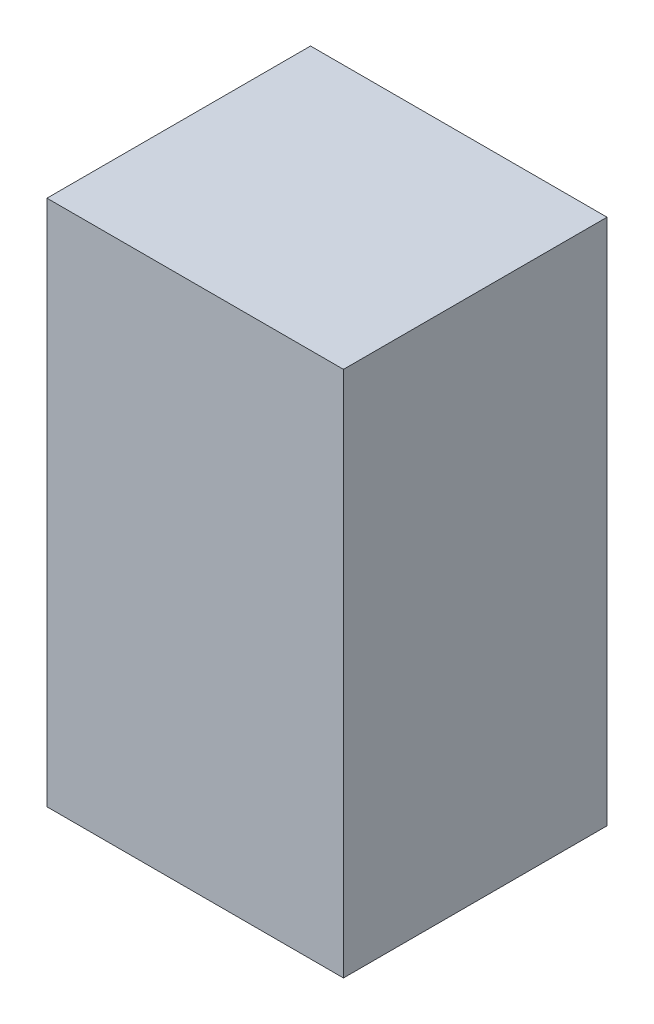
ISO-10303-21;
HEADER;
FILE_DESCRIPTION(('STEP AP214'),'2;1');
FILE_NAME('part.step','',(''),(''),'','','');
FILE_SCHEMA(('AUTOMOTIVE_DESIGN { 1 0 10303 214 1 1 1 1 }'));
ENDSEC;
DATA;
#1=APPLICATION_CONTEXT('core data for automotive mechanical design processes');
#2=APPLICATION_PROTOCOL_DEFINITION('international standard','automotive_design',2000,#1);
#3=PRODUCT_CONTEXT('',#1,'mechanical');
#4=PRODUCT('Part','Part','',(#3));
#5=PRODUCT_RELATED_PRODUCT_CATEGORY('part','',(#4));
#6=PRODUCT_DEFINITION_FORMATION('','',#4);
#7=PRODUCT_DEFINITION_CONTEXT('part definition',#1,'design');
#8=PRODUCT_DEFINITION('design','',#6,#7);
#9=PRODUCT_DEFINITION_SHAPE('','',#8);
#10=(LENGTH_UNIT() NAMED_UNIT(*) SI_UNIT(.MILLI.,.METRE.));
#11=(NAMED_UNIT(*) PLANE_ANGLE_UNIT() SI_UNIT($,.RADIAN.));
#12=(NAMED_UNIT(*) SI_UNIT($,.STERADIAN.) SOLID_ANGLE_UNIT());
#13=UNCERTAINTY_MEASURE_WITH_UNIT(LENGTH_MEASURE(1.E-05),#10,'distance_accuracy_value','');
#14=(GEOMETRIC_REPRESENTATION_CONTEXT(3) GLOBAL_UNCERTAINTY_ASSIGNED_CONTEXT((#13)) GLOBAL_UNIT_ASSIGNED_CONTEXT((#10,
#11,#12)) REPRESENTATION_CONTEXT('',''));
#15=CARTESIAN_POINT('',(0.,0.,0.));
#16=DIRECTION('',(0.,0.,1.));
#17=DIRECTION('',(1.,0.,0.));
#18=AXIS2_PLACEMENT_3D('',#15,#16,#17);
#19=CARTESIAN_POINT('',(580.,220.,-248.));
#20=DIRECTION('',(-1.,0.,0.));
#21=DIRECTION('',(0.,0.,1.));
#22=AXIS2_PLACEMENT_3D('',#19,#20,#21);
#23=PLANE('',#22);
#24=DIRECTION('',(0.,-1.,0.));
#25=VECTOR('',#24,1.);
#26=CARTESIAN_POINT('',(580.,220.,-208.));
#27=LINE('',#26,#25);
#28=CARTESIAN_POINT('',(580.,300.,-208.));
#29=VERTEX_POINT('',#28);
#30=CARTESIAN_POINT('',(580.,220.,-208.));
#31=VERTEX_POINT('',#30);
#32=EDGE_CURVE('E103',#29,#31,#27,.T.);
#33=ORIENTED_EDGE('',*,*,#32,.F.);
#34=DIRECTION('',(0.,0.,1.));
#35=VECTOR('',#34,1.);
#36=CARTESIAN_POINT('',(580.,300.,-248.));
#37=LINE('',#36,#35);
#38=CARTESIAN_POINT('',(580.,300.,-248.));
#39=VERTEX_POINT('',#38);
#40=EDGE_CURVE('E11',#39,#29,#37,.T.);
#41=ORIENTED_EDGE('',*,*,#40,.F.);
#42=DIRECTION('',(0.,-1.,0.));
#43=VECTOR('',#42,1.);
#44=CARTESIAN_POINT('',(580.,220.,-248.));
#45=LINE('',#44,#43);
#46=CARTESIAN_POINT('',(580.,220.,-248.));
#47=VERTEX_POINT('',#46);
#48=EDGE_CURVE('E97',#39,#47,#45,.T.);
#49=ORIENTED_EDGE('',*,*,#48,.T.);
#50=DIRECTION('',(0.,0.,1.));
#51=VECTOR('',#50,1.);
#52=CARTESIAN_POINT('',(580.,220.,-248.));
#53=LINE('',#52,#51);
#54=EDGE_CURVE('E42',#47,#31,#53,.T.);
#55=ORIENTED_EDGE('',*,*,#54,.T.);
#56=EDGE_LOOP('',(#33,#41,#49,#55));
#57=FACE_BOUND('',#56,.T.);
#58=ADVANCED_FACE('F39',(#57),#23,.T.);
#59=CARTESIAN_POINT('',(580.,300.,-248.));
#60=DIRECTION('',(0.,1.,0.));
#61=DIRECTION('',(0.,0.,1.));
#62=AXIS2_PLACEMENT_3D('',#59,#60,#61);
#63=PLANE('',#62);
#64=DIRECTION('',(-1.,0.,0.));
#65=VECTOR('',#64,1.);
#66=CARTESIAN_POINT('',(580.,300.,-208.));
#67=LINE('',#66,#65);
#68=CARTESIAN_POINT('',(625.,300.,-208.));
#69=VERTEX_POINT('',#68);
#70=EDGE_CURVE('E99',#69,#29,#67,.T.);
#71=ORIENTED_EDGE('',*,*,#70,.F.);
#72=DIRECTION('',(0.,0.,1.));
#73=VECTOR('',#72,1.);
#74=CARTESIAN_POINT('',(625.,300.,-248.));
#75=LINE('',#74,#73);
#76=CARTESIAN_POINT('',(625.,300.,-248.));
#77=VERTEX_POINT('',#76);
#78=EDGE_CURVE('E48',#77,#69,#75,.T.);
#79=ORIENTED_EDGE('',*,*,#78,.F.);
#80=DIRECTION('',(-1.,0.,0.));
#81=VECTOR('',#80,1.);
#82=CARTESIAN_POINT('',(580.,300.,-248.));
#83=LINE('',#82,#81);
#84=EDGE_CURVE('E94',#77,#39,#83,.T.);
#85=ORIENTED_EDGE('',*,*,#84,.T.);
#86=ORIENTED_EDGE('',*,*,#40,.T.);
#87=EDGE_LOOP('',(#71,#79,#85,#86));
#88=FACE_BOUND('',#87,.T.);
#89=ADVANCED_FACE('F113',(#88),#63,.T.);
#90=CARTESIAN_POINT('',(625.,220.,-248.));
#91=DIRECTION('',(1.,0.,0.));
#92=DIRECTION('',(0.,0.,-1.));
#93=AXIS2_PLACEMENT_3D('',#90,#91,#92);
#94=PLANE('',#93);
#95=DIRECTION('',(0.,1.,0.));
#96=VECTOR('',#95,1.);
#97=CARTESIAN_POINT('',(625.,220.,-208.));
#98=LINE('',#97,#96);
#99=CARTESIAN_POINT('',(625.,220.,-208.));
#100=VERTEX_POINT('',#99);
#101=EDGE_CURVE('E89',#100,#69,#98,.T.);
#102=ORIENTED_EDGE('',*,*,#101,.F.);
#103=DIRECTION('',(0.,0.,1.));
#104=VECTOR('',#103,1.);
#105=CARTESIAN_POINT('',(625.,220.,-248.));
#106=LINE('',#105,#104);
#107=CARTESIAN_POINT('',(625.,220.,-248.));
#108=VERTEX_POINT('',#107);
#109=EDGE_CURVE('E84',#108,#100,#106,.T.);
#110=ORIENTED_EDGE('',*,*,#109,.F.);
#111=DIRECTION('',(0.,1.,0.));
#112=VECTOR('',#111,1.);
#113=CARTESIAN_POINT('',(625.,220.,-248.));
#114=LINE('',#113,#112);
#115=EDGE_CURVE('E87',#108,#77,#114,.T.);
#116=ORIENTED_EDGE('',*,*,#115,.T.);
#117=ORIENTED_EDGE('',*,*,#78,.T.);
#118=EDGE_LOOP('',(#102,#110,#116,#117));
#119=FACE_BOUND('',#118,.T.);
#120=ADVANCED_FACE('F86',(#119),#94,.T.);
#121=CARTESIAN_POINT('',(580.,220.,-248.));
#122=DIRECTION('',(0.,-1.,0.));
#123=DIRECTION('',(0.,0.,-1.));
#124=AXIS2_PLACEMENT_3D('',#121,#122,#123);
#125=PLANE('',#124);
#126=DIRECTION('',(1.,0.,0.));
#127=VECTOR('',#126,1.);
#128=CARTESIAN_POINT('',(580.,220.,-208.));
#129=LINE('',#128,#127);
#130=EDGE_CURVE('E106',#31,#100,#129,.T.);
#131=ORIENTED_EDGE('',*,*,#130,.F.);
#132=ORIENTED_EDGE('',*,*,#54,.F.);
#133=DIRECTION('',(1.,0.,0.));
#134=VECTOR('',#133,1.);
#135=CARTESIAN_POINT('',(580.,220.,-248.));
#136=LINE('',#135,#134);
#137=EDGE_CURVE('E93',#47,#108,#136,.T.);
#138=ORIENTED_EDGE('',*,*,#137,.T.);
#139=ORIENTED_EDGE('',*,*,#109,.T.);
#140=EDGE_LOOP('',(#131,#132,#138,#139));
#141=FACE_BOUND('',#140,.T.);
#142=ADVANCED_FACE('F96',(#141),#125,.T.);
#143=CARTESIAN_POINT('',(0.,0.,-248.));
#144=DIRECTION('',(0.,0.,-1.));
#145=DIRECTION('',(-1.,0.,0.));
#146=AXIS2_PLACEMENT_3D('',#143,#144,#145);
#147=PLANE('',#146);
#148=ORIENTED_EDGE('',*,*,#48,.F.);
#149=ORIENTED_EDGE('',*,*,#84,.F.);
#150=ORIENTED_EDGE('',*,*,#115,.F.);
#151=ORIENTED_EDGE('',*,*,#137,.F.);
#152=EDGE_LOOP('',(#148,#149,#150,#151));
#153=FACE_BOUND('',#152,.T.);
#154=ADVANCED_FACE('F92',(#153),#147,.T.);
#155=CARTESIAN_POINT('',(0.,0.,-208.));
#156=DIRECTION('',(0.,0.,-1.));
#157=DIRECTION('',(-1.,0.,0.));
#158=AXIS2_PLACEMENT_3D('',#155,#156,#157);
#159=PLANE('',#158);
#160=ORIENTED_EDGE('',*,*,#32,.T.);
#161=ORIENTED_EDGE('',*,*,#130,.T.);
#162=ORIENTED_EDGE('',*,*,#101,.T.);
#163=ORIENTED_EDGE('',*,*,#70,.T.);
#164=EDGE_LOOP('',(#160,#161,#162,#163));
#165=FACE_BOUND('',#164,.T.);
#166=ADVANCED_FACE('F112',(#165),#159,.F.);
#167=CLOSED_SHELL('',(#58,#89,#120,#142,#154,#166));
#168=MANIFOLD_SOLID_BREP('B2',#167);
#169=ADVANCED_BREP_SHAPE_REPRESENTATION('',(#18,#168),#14);
#170=SHAPE_DEFINITION_REPRESENTATION(#9,#169);
ENDSEC;
END-ISO-10303-21;
